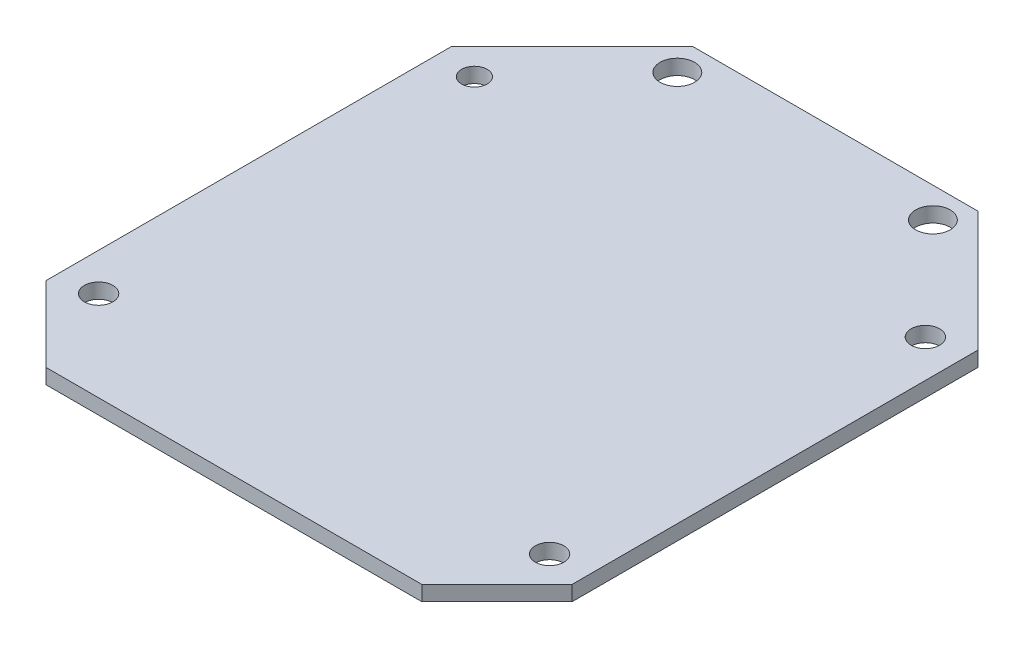
ISO-10303-21;
HEADER;
FILE_DESCRIPTION(('STEP AP214'),'2;1');
FILE_NAME('part.step','',(''),(''),'','','');
FILE_SCHEMA(('AUTOMOTIVE_DESIGN { 1 0 10303 214 1 1 1 1 }'));
ENDSEC;
DATA;
#1=APPLICATION_CONTEXT('core data for automotive mechanical design processes');
#2=APPLICATION_PROTOCOL_DEFINITION('international standard','automotive_design',2000,#1);
#3=PRODUCT_CONTEXT('',#1,'mechanical');
#4=PRODUCT('Part','Part','',(#3));
#5=PRODUCT_RELATED_PRODUCT_CATEGORY('part','',(#4));
#6=PRODUCT_DEFINITION_FORMATION('','',#4);
#7=PRODUCT_DEFINITION_CONTEXT('part definition',#1,'design');
#8=PRODUCT_DEFINITION('design','',#6,#7);
#9=PRODUCT_DEFINITION_SHAPE('','',#8);
#10=(LENGTH_UNIT() NAMED_UNIT(*) SI_UNIT(.MILLI.,.METRE.));
#11=(NAMED_UNIT(*) PLANE_ANGLE_UNIT() SI_UNIT($,.RADIAN.));
#12=(NAMED_UNIT(*) SI_UNIT($,.STERADIAN.) SOLID_ANGLE_UNIT());
#13=UNCERTAINTY_MEASURE_WITH_UNIT(LENGTH_MEASURE(1.E-05),#10,'distance_accuracy_value','');
#14=(GEOMETRIC_REPRESENTATION_CONTEXT(3) GLOBAL_UNCERTAINTY_ASSIGNED_CONTEXT((#13)) GLOBAL_UNIT_ASSIGNED_CONTEXT((#10,
#11,#12)) REPRESENTATION_CONTEXT('',''));
#15=CARTESIAN_POINT('',(0.,0.,0.));
#16=DIRECTION('',(0.,0.,1.));
#17=DIRECTION('',(1.,0.,0.));
#18=AXIS2_PLACEMENT_3D('',#15,#16,#17);
#19=CARTESIAN_POINT('',(35.,1.,1.8900618421344));
#20=DIRECTION('',(-0.707106781186549,0.,-0.707106781186546));
#21=DIRECTION('',(-0.707106781186546,0.,0.707106781186549));
#22=AXIS2_PLACEMENT_3D('',#19,#20,#21);
#23=PLANE('',#22);
#24=DIRECTION('',(0.707106781186546,0.,-0.707106781186549));
#25=VECTOR('',#24,1.);
#26=CARTESIAN_POINT('',(35.,0.,1.8900618421344));
#27=LINE('',#26,#25);
#28=CARTESIAN_POINT('',(30.,0.,6.89006184213443));
#29=VERTEX_POINT('',#28);
#30=CARTESIAN_POINT('',(35.,0.,1.8900618421344));
#31=VERTEX_POINT('',#30);
#32=EDGE_CURVE('E132',#29,#31,#27,.T.);
#33=ORIENTED_EDGE('',*,*,#32,.T.);
#34=DIRECTION('',(0.,-1.,0.));
#35=VECTOR('',#34,1.);
#36=CARTESIAN_POINT('',(35.,1.,1.8900618421344));
#37=LINE('',#36,#35);
#38=CARTESIAN_POINT('',(35.,1.,1.8900618421344));
#39=VERTEX_POINT('',#38);
#40=EDGE_CURVE('E11',#39,#31,#37,.T.);
#41=ORIENTED_EDGE('',*,*,#40,.F.);
#42=DIRECTION('',(0.707106781186546,0.,-0.707106781186549));
#43=VECTOR('',#42,1.);
#44=CARTESIAN_POINT('',(35.,1.,1.8900618421344));
#45=LINE('',#44,#43);
#46=CARTESIAN_POINT('',(30.,1.,6.89006184213443));
#47=VERTEX_POINT('',#46);
#48=EDGE_CURVE('E147',#47,#39,#45,.T.);
#49=ORIENTED_EDGE('',*,*,#48,.F.);
#50=DIRECTION('',(0.,-1.,0.));
#51=VECTOR('',#50,1.);
#52=CARTESIAN_POINT('',(30.,1.,6.89006184213443));
#53=LINE('',#52,#51);
#54=EDGE_CURVE('E128',#47,#29,#53,.T.);
#55=ORIENTED_EDGE('',*,*,#54,.T.);
#56=EDGE_LOOP('',(#33,#41,#49,#55));
#57=FACE_BOUND('',#56,.T.);
#58=ADVANCED_FACE('F36',(#57),#23,.F.);
#59=CARTESIAN_POINT('',(35.,1.,-25.1099381578656));
#60=DIRECTION('',(-1.,0.,0.));
#61=DIRECTION('',(0.,0.,1.));
#62=AXIS2_PLACEMENT_3D('',#59,#60,#61);
#63=PLANE('',#62);
#64=DIRECTION('',(0.,0.,-1.));
#65=VECTOR('',#64,1.);
#66=CARTESIAN_POINT('',(35.,0.,-25.1099381578656));
#67=LINE('',#66,#65);
#68=CARTESIAN_POINT('',(35.,0.,-25.1099381578656));
#69=VERTEX_POINT('',#68);
#70=EDGE_CURVE('E135',#31,#69,#67,.T.);
#71=ORIENTED_EDGE('',*,*,#70,.T.);
#72=DIRECTION('',(0.,-1.,0.));
#73=VECTOR('',#72,1.);
#74=CARTESIAN_POINT('',(35.,1.,-25.1099381578656));
#75=LINE('',#74,#73);
#76=CARTESIAN_POINT('',(35.,1.,-25.1099381578656));
#77=VERTEX_POINT('',#76);
#78=EDGE_CURVE('E44',#77,#69,#75,.T.);
#79=ORIENTED_EDGE('',*,*,#78,.F.);
#80=DIRECTION('',(0.,0.,-1.));
#81=VECTOR('',#80,1.);
#82=CARTESIAN_POINT('',(35.,1.,-25.1099381578656));
#83=LINE('',#82,#81);
#84=EDGE_CURVE('E95',#39,#77,#83,.T.);
#85=ORIENTED_EDGE('',*,*,#84,.F.);
#86=ORIENTED_EDGE('',*,*,#40,.T.);
#87=EDGE_LOOP('',(#71,#79,#85,#86));
#88=FACE_BOUND('',#87,.T.);
#89=ADVANCED_FACE('F255',(#88),#63,.F.);
#90=CARTESIAN_POINT('',(27.,1.,-33.1099381578656));
#91=DIRECTION('',(-0.707106781186549,0.,0.707106781186546));
#92=DIRECTION('',(0.707106781186546,0.,0.707106781186549));
#93=AXIS2_PLACEMENT_3D('',#90,#91,#92);
#94=PLANE('',#93);
#95=DIRECTION('',(-0.707106781186546,0.,-0.707106781186549));
#96=VECTOR('',#95,1.);
#97=CARTESIAN_POINT('',(27.,0.,-33.1099381578656));
#98=LINE('',#97,#96);
#99=CARTESIAN_POINT('',(27.,0.,-33.1099381578656));
#100=VERTEX_POINT('',#99);
#101=EDGE_CURVE('E138',#69,#100,#98,.T.);
#102=ORIENTED_EDGE('',*,*,#101,.T.);
#103=DIRECTION('',(0.,-1.,0.));
#104=VECTOR('',#103,1.);
#105=CARTESIAN_POINT('',(27.,1.,-33.1099381578656));
#106=LINE('',#105,#104);
#107=CARTESIAN_POINT('',(27.,1.,-33.1099381578656));
#108=VERTEX_POINT('',#107);
#109=EDGE_CURVE('E154',#108,#100,#106,.T.);
#110=ORIENTED_EDGE('',*,*,#109,.F.);
#111=DIRECTION('',(-0.707106781186546,0.,-0.707106781186549));
#112=VECTOR('',#111,1.);
#113=CARTESIAN_POINT('',(27.,1.,-33.1099381578656));
#114=LINE('',#113,#112);
#115=EDGE_CURVE('E162',#77,#108,#114,.T.);
#116=ORIENTED_EDGE('',*,*,#115,.F.);
#117=ORIENTED_EDGE('',*,*,#78,.T.);
#118=EDGE_LOOP('',(#102,#110,#116,#117));
#119=FACE_BOUND('',#118,.T.);
#120=ADVANCED_FACE('F160',(#119),#94,.F.);
#121=CARTESIAN_POINT('',(8.00000000000003,1.,-33.1099381578656));
#122=DIRECTION('',(0.,0.,1.));
#123=DIRECTION('',(1.,0.,0.));
#124=AXIS2_PLACEMENT_3D('',#121,#122,#123);
#125=PLANE('',#124);
#126=DIRECTION('',(-1.,0.,0.));
#127=VECTOR('',#126,1.);
#128=CARTESIAN_POINT('',(8.00000000000003,0.,-33.1099381578656));
#129=LINE('',#128,#127);
#130=CARTESIAN_POINT('',(8.00000000000003,0.,-33.1099381578656));
#131=VERTEX_POINT('',#130);
#132=EDGE_CURVE('E140',#100,#131,#129,.T.);
#133=ORIENTED_EDGE('',*,*,#132,.T.);
#134=DIRECTION('',(0.,-1.,0.));
#135=VECTOR('',#134,1.);
#136=CARTESIAN_POINT('',(8.00000000000003,1.,-33.1099381578656));
#137=LINE('',#136,#135);
#138=CARTESIAN_POINT('',(8.00000000000003,1.,-33.1099381578656));
#139=VERTEX_POINT('',#138);
#140=EDGE_CURVE('E151',#139,#131,#137,.T.);
#141=ORIENTED_EDGE('',*,*,#140,.F.);
#142=DIRECTION('',(-1.,0.,0.));
#143=VECTOR('',#142,1.);
#144=CARTESIAN_POINT('',(8.00000000000003,1.,-33.1099381578656));
#145=LINE('',#144,#143);
#146=EDGE_CURVE('E174',#108,#139,#145,.T.);
#147=ORIENTED_EDGE('',*,*,#146,.F.);
#148=ORIENTED_EDGE('',*,*,#109,.T.);
#149=EDGE_LOOP('',(#133,#141,#147,#148));
#150=FACE_BOUND('',#149,.T.);
#151=ADVANCED_FACE('F170',(#150),#125,.F.);
#152=CARTESIAN_POINT('',(0.,1.,-25.1099381578656));
#153=DIRECTION('',(0.707106781186546,0.,0.707106781186549));
#154=DIRECTION('',(0.707106781186549,0.,-0.707106781186546));
#155=AXIS2_PLACEMENT_3D('',#152,#153,#154);
#156=PLANE('',#155);
#157=DIRECTION('',(-0.707106781186549,0.,0.707106781186546));
#158=VECTOR('',#157,1.);
#159=CARTESIAN_POINT('',(0.,0.,-25.1099381578656));
#160=LINE('',#159,#158);
#161=CARTESIAN_POINT('',(0.,0.,-25.1099381578656));
#162=VERTEX_POINT('',#161);
#163=EDGE_CURVE('E142',#131,#162,#160,.T.);
#164=ORIENTED_EDGE('',*,*,#163,.T.);
#165=DIRECTION('',(0.,-1.,0.));
#166=VECTOR('',#165,1.);
#167=CARTESIAN_POINT('',(0.,1.,-25.1099381578656));
#168=LINE('',#167,#166);
#169=CARTESIAN_POINT('',(0.,1.,-25.1099381578656));
#170=VERTEX_POINT('',#169);
#171=EDGE_CURVE('E123',#170,#162,#168,.T.);
#172=ORIENTED_EDGE('',*,*,#171,.F.);
#173=DIRECTION('',(-0.707106781186549,0.,0.707106781186546));
#174=VECTOR('',#173,1.);
#175=CARTESIAN_POINT('',(0.,1.,-25.1099381578656));
#176=LINE('',#175,#174);
#177=EDGE_CURVE('E114',#139,#170,#176,.T.);
#178=ORIENTED_EDGE('',*,*,#177,.F.);
#179=ORIENTED_EDGE('',*,*,#140,.T.);
#180=EDGE_LOOP('',(#164,#172,#178,#179));
#181=FACE_BOUND('',#180,.T.);
#182=ADVANCED_FACE('F173',(#181),#156,.F.);
#183=CARTESIAN_POINT('',(0.,1.,1.89006184213442));
#184=DIRECTION('',(1.,0.,0.));
#185=DIRECTION('',(0.,0.,-1.));
#186=AXIS2_PLACEMENT_3D('',#183,#184,#185);
#187=PLANE('',#186);
#188=DIRECTION('',(0.,0.,1.));
#189=VECTOR('',#188,1.);
#190=CARTESIAN_POINT('',(0.,0.,1.89006184213442));
#191=LINE('',#190,#189);
#192=CARTESIAN_POINT('',(0.,0.,1.89006184213442));
#193=VERTEX_POINT('',#192);
#194=EDGE_CURVE('E122',#162,#193,#191,.T.);
#195=ORIENTED_EDGE('',*,*,#194,.T.);
#196=DIRECTION('',(0.,-1.,0.));
#197=VECTOR('',#196,1.);
#198=CARTESIAN_POINT('',(0.,1.,1.89006184213442));
#199=LINE('',#198,#197);
#200=CARTESIAN_POINT('',(0.,1.,1.89006184213442));
#201=VERTEX_POINT('',#200);
#202=EDGE_CURVE('E119',#201,#193,#199,.T.);
#203=ORIENTED_EDGE('',*,*,#202,.F.);
#204=DIRECTION('',(0.,0.,1.));
#205=VECTOR('',#204,1.);
#206=CARTESIAN_POINT('',(0.,1.,1.89006184213442));
#207=LINE('',#206,#205);
#208=EDGE_CURVE('E108',#170,#201,#207,.T.);
#209=ORIENTED_EDGE('',*,*,#208,.F.);
#210=ORIENTED_EDGE('',*,*,#171,.T.);
#211=EDGE_LOOP('',(#195,#203,#209,#210));
#212=FACE_BOUND('',#211,.T.);
#213=ADVANCED_FACE('F120',(#212),#187,.F.);
#214=CARTESIAN_POINT('',(5.,1.,6.89006184213443));
#215=DIRECTION('',(0.707106781186549,0.,-0.707106781186547));
#216=DIRECTION('',(-0.707106781186546,0.,-0.707106781186549));
#217=AXIS2_PLACEMENT_3D('',#214,#215,#216);
#218=PLANE('',#217);
#219=DIRECTION('',(0.707106781186546,0.,0.707106781186548));
#220=VECTOR('',#219,1.);
#221=CARTESIAN_POINT('',(5.,0.,6.89006184213443));
#222=LINE('',#221,#220);
#223=CARTESIAN_POINT('',(5.,0.,6.89006184213443));
#224=VERTEX_POINT('',#223);
#225=EDGE_CURVE('E81',#193,#224,#222,.T.);
#226=ORIENTED_EDGE('',*,*,#225,.T.);
#227=DIRECTION('',(0.,-1.,0.));
#228=VECTOR('',#227,1.);
#229=CARTESIAN_POINT('',(5.,1.,6.89006184213443));
#230=LINE('',#229,#228);
#231=CARTESIAN_POINT('',(5.,1.,6.89006184213443));
#232=VERTEX_POINT('',#231);
#233=EDGE_CURVE('E124',#232,#224,#230,.T.);
#234=ORIENTED_EDGE('',*,*,#233,.F.);
#235=DIRECTION('',(0.707106781186546,0.,0.707106781186548));
#236=VECTOR('',#235,1.);
#237=CARTESIAN_POINT('',(5.,1.,6.89006184213443));
#238=LINE('',#237,#236);
#239=EDGE_CURVE('E112',#201,#232,#238,.T.);
#240=ORIENTED_EDGE('',*,*,#239,.F.);
#241=ORIENTED_EDGE('',*,*,#202,.T.);
#242=EDGE_LOOP('',(#226,#234,#240,#241));
#243=FACE_BOUND('',#242,.T.);
#244=ADVANCED_FACE('F126',(#243),#218,.F.);
#245=CARTESIAN_POINT('',(30.,1.,6.89006184213443));
#246=DIRECTION('',(0.,0.,-1.));
#247=DIRECTION('',(-1.,0.,0.));
#248=AXIS2_PLACEMENT_3D('',#245,#246,#247);
#249=PLANE('',#248);
#250=DIRECTION('',(1.,0.,0.));
#251=VECTOR('',#250,1.);
#252=CARTESIAN_POINT('',(30.,0.,6.89006184213443));
#253=LINE('',#252,#251);
#254=EDGE_CURVE('E87',#224,#29,#253,.T.);
#255=ORIENTED_EDGE('',*,*,#254,.T.);
#256=ORIENTED_EDGE('',*,*,#54,.F.);
#257=DIRECTION('',(1.,0.,0.));
#258=VECTOR('',#257,1.);
#259=CARTESIAN_POINT('',(30.,1.,6.89006184213443));
#260=LINE('',#259,#258);
#261=EDGE_CURVE('E52',#232,#47,#260,.T.);
#262=ORIENTED_EDGE('',*,*,#261,.F.);
#263=ORIENTED_EDGE('',*,*,#233,.T.);
#264=EDGE_LOOP('',(#255,#256,#262,#263));
#265=FACE_BOUND('',#264,.T.);
#266=ADVANCED_FACE('F227',(#265),#249,.F.);
#267=CARTESIAN_POINT('',(0.,1.,0.));
#268=DIRECTION('',(0.,-1.,0.));
#269=DIRECTION('',(0.,0.,-1.));
#270=AXIS2_PLACEMENT_3D('',#267,#268,#269);
#271=PLANE('',#270);
#272=CARTESIAN_POINT('',(26.,1.,-31.1099381578656));
#273=DIRECTION('',(0.,1.,0.));
#274=DIRECTION('',(0.,0.,1.));
#275=AXIS2_PLACEMENT_3D('',#272,#273,#274);
#276=CIRCLE('',#275,1.15);
#277=CARTESIAN_POINT('',(26.,1.,-29.9599381578656));
#278=VERTEX_POINT('',#277);
#279=EDGE_CURVE('E210',#278,#278,#276,.T.);
#280=ORIENTED_EDGE('',*,*,#279,.F.);
#281=EDGE_LOOP('',(#280));
#282=FACE_BOUND('',#281,.T.);
#283=CARTESIAN_POINT('',(9.,1.,-31.1099381578656));
#284=DIRECTION('',(0.,1.,0.));
#285=DIRECTION('',(0.,0.,1.));
#286=AXIS2_PLACEMENT_3D('',#283,#284,#285);
#287=CIRCLE('',#286,1.15);
#288=CARTESIAN_POINT('',(9.,1.,-29.9599381578656));
#289=VERTEX_POINT('',#288);
#290=EDGE_CURVE('E204',#289,#289,#287,.T.);
#291=ORIENTED_EDGE('',*,*,#290,.F.);
#292=EDGE_LOOP('',(#291));
#293=FACE_BOUND('',#292,.T.);
#294=CARTESIAN_POINT('',(2.5,1.,0.890061842134429));
#295=DIRECTION('',(0.,1.,0.));
#296=DIRECTION('',(0.,0.,1.));
#297=AXIS2_PLACEMENT_3D('',#294,#295,#296);
#298=CIRCLE('',#297,0.95);
#299=CARTESIAN_POINT('',(2.5,1.,1.84006184213443));
#300=VERTEX_POINT('',#299);
#301=EDGE_CURVE('E193',#300,#300,#298,.T.);
#302=ORIENTED_EDGE('',*,*,#301,.F.);
#303=EDGE_LOOP('',(#302));
#304=FACE_BOUND('',#303,.T.);
#305=CARTESIAN_POINT('',(32.5,1.,-24.1099381578656));
#306=DIRECTION('',(0.,1.,0.));
#307=DIRECTION('',(0.,0.,1.));
#308=AXIS2_PLACEMENT_3D('',#305,#306,#307);
#309=CIRCLE('',#308,0.950000000000001);
#310=CARTESIAN_POINT('',(32.5,1.,-23.1599381578656));
#311=VERTEX_POINT('',#310);
#312=EDGE_CURVE('E186',#311,#311,#309,.T.);
#313=ORIENTED_EDGE('',*,*,#312,.F.);
#314=EDGE_LOOP('',(#313));
#315=FACE_BOUND('',#314,.T.);
#316=CARTESIAN_POINT('',(2.5,1.,-24.1099381578656));
#317=DIRECTION('',(0.,1.,0.));
#318=DIRECTION('',(0.,0.,1.));
#319=AXIS2_PLACEMENT_3D('',#316,#317,#318);
#320=CIRCLE('',#319,0.85);
#321=CARTESIAN_POINT('',(2.5,1.,-23.2599381578656));
#322=VERTEX_POINT('',#321);
#323=EDGE_CURVE('E198',#322,#322,#320,.T.);
#324=ORIENTED_EDGE('',*,*,#323,.F.);
#325=EDGE_LOOP('',(#324));
#326=FACE_BOUND('',#325,.T.);
#327=CARTESIAN_POINT('',(32.5,1.,0.89006184213443));
#328=DIRECTION('',(0.,1.,0.));
#329=DIRECTION('',(0.,0.,1.));
#330=AXIS2_PLACEMENT_3D('',#327,#328,#329);
#331=CIRCLE('',#330,0.950000000000001);
#332=CARTESIAN_POINT('',(32.5,1.,1.84006184213443));
#333=VERTEX_POINT('',#332);
#334=EDGE_CURVE('E180',#333,#333,#331,.T.);
#335=ORIENTED_EDGE('',*,*,#334,.F.);
#336=EDGE_LOOP('',(#335));
#337=FACE_BOUND('',#336,.T.);
#338=ORIENTED_EDGE('',*,*,#48,.T.);
#339=ORIENTED_EDGE('',*,*,#84,.T.);
#340=ORIENTED_EDGE('',*,*,#115,.T.);
#341=ORIENTED_EDGE('',*,*,#146,.T.);
#342=ORIENTED_EDGE('',*,*,#177,.T.);
#343=ORIENTED_EDGE('',*,*,#208,.T.);
#344=ORIENTED_EDGE('',*,*,#239,.T.);
#345=ORIENTED_EDGE('',*,*,#261,.T.);
#346=EDGE_LOOP('',(#338,#339,#340,#341,#342,#343,#344,#345));
#347=FACE_BOUND('',#346,.T.);
#348=ADVANCED_FACE('F110',(#282,#293,#304,#315,#326,#337,#347),#271,.F.);
#349=CARTESIAN_POINT('',(0.,0.,0.));
#350=DIRECTION('',(0.,-1.,0.));
#351=DIRECTION('',(0.,0.,-1.));
#352=AXIS2_PLACEMENT_3D('',#349,#350,#351);
#353=PLANE('',#352);
#354=CARTESIAN_POINT('',(26.,0.,-31.1099381578656));
#355=DIRECTION('',(0.,1.,0.));
#356=DIRECTION('',(0.,0.,1.));
#357=AXIS2_PLACEMENT_3D('',#354,#355,#356);
#358=CIRCLE('',#357,1.15);
#359=CARTESIAN_POINT('',(26.,0.,-29.9599381578656));
#360=VERTEX_POINT('',#359);
#361=EDGE_CURVE('E201',#360,#360,#358,.T.);
#362=ORIENTED_EDGE('',*,*,#361,.T.);
#363=EDGE_LOOP('',(#362));
#364=FACE_BOUND('',#363,.T.);
#365=CARTESIAN_POINT('',(9.,0.,-31.1099381578656));
#366=DIRECTION('',(0.,1.,0.));
#367=DIRECTION('',(0.,0.,1.));
#368=AXIS2_PLACEMENT_3D('',#365,#366,#367);
#369=CIRCLE('',#368,1.15);
#370=CARTESIAN_POINT('',(9.,0.,-29.9599381578656));
#371=VERTEX_POINT('',#370);
#372=EDGE_CURVE('E207',#371,#371,#369,.T.);
#373=ORIENTED_EDGE('',*,*,#372,.T.);
#374=EDGE_LOOP('',(#373));
#375=FACE_BOUND('',#374,.T.);
#376=CARTESIAN_POINT('',(2.5,0.,0.890061842134429));
#377=DIRECTION('',(0.,1.,0.));
#378=DIRECTION('',(0.,0.,1.));
#379=AXIS2_PLACEMENT_3D('',#376,#377,#378);
#380=CIRCLE('',#379,0.95);
#381=CARTESIAN_POINT('',(2.5,0.,1.84006184213443));
#382=VERTEX_POINT('',#381);
#383=EDGE_CURVE('E183',#382,#382,#380,.T.);
#384=ORIENTED_EDGE('',*,*,#383,.T.);
#385=EDGE_LOOP('',(#384));
#386=FACE_BOUND('',#385,.T.);
#387=CARTESIAN_POINT('',(32.5,0.,-24.1099381578656));
#388=DIRECTION('',(0.,1.,0.));
#389=DIRECTION('',(0.,0.,1.));
#390=AXIS2_PLACEMENT_3D('',#387,#388,#389);
#391=CIRCLE('',#390,0.950000000000001);
#392=CARTESIAN_POINT('',(32.5,0.,-23.1599381578656));
#393=VERTEX_POINT('',#392);
#394=EDGE_CURVE('E189',#393,#393,#391,.T.);
#395=ORIENTED_EDGE('',*,*,#394,.T.);
#396=EDGE_LOOP('',(#395));
#397=FACE_BOUND('',#396,.T.);
#398=CARTESIAN_POINT('',(2.5,0.,-24.1099381578656));
#399=DIRECTION('',(0.,1.,0.));
#400=DIRECTION('',(0.,0.,1.));
#401=AXIS2_PLACEMENT_3D('',#398,#399,#400);
#402=CIRCLE('',#401,0.85);
#403=CARTESIAN_POINT('',(2.5,0.,-23.2599381578656));
#404=VERTEX_POINT('',#403);
#405=EDGE_CURVE('E190',#404,#404,#402,.T.);
#406=ORIENTED_EDGE('',*,*,#405,.T.);
#407=EDGE_LOOP('',(#406));
#408=FACE_BOUND('',#407,.T.);
#409=CARTESIAN_POINT('',(32.5,0.,0.89006184213443));
#410=DIRECTION('',(0.,1.,0.));
#411=DIRECTION('',(0.,0.,1.));
#412=AXIS2_PLACEMENT_3D('',#409,#410,#411);
#413=CIRCLE('',#412,0.950000000000001);
#414=CARTESIAN_POINT('',(32.5,0.,1.84006184213443));
#415=VERTEX_POINT('',#414);
#416=EDGE_CURVE('E136',#415,#415,#413,.T.);
#417=ORIENTED_EDGE('',*,*,#416,.T.);
#418=EDGE_LOOP('',(#417));
#419=FACE_BOUND('',#418,.T.);
#420=ORIENTED_EDGE('',*,*,#32,.F.);
#421=ORIENTED_EDGE('',*,*,#254,.F.);
#422=ORIENTED_EDGE('',*,*,#225,.F.);
#423=ORIENTED_EDGE('',*,*,#194,.F.);
#424=ORIENTED_EDGE('',*,*,#163,.F.);
#425=ORIENTED_EDGE('',*,*,#132,.F.);
#426=ORIENTED_EDGE('',*,*,#101,.F.);
#427=ORIENTED_EDGE('',*,*,#70,.F.);
#428=EDGE_LOOP('',(#420,#421,#422,#423,#424,#425,#426,#427));
#429=FACE_BOUND('',#428,.T.);
#430=ADVANCED_FACE('F166',(#364,#375,#386,#397,#408,#419,#429),#353,.T.);
#431=CARTESIAN_POINT('',(32.5,0.,0.89006184213443));
#432=DIRECTION('',(0.,1.,0.));
#433=DIRECTION('',(0.,0.,1.));
#434=AXIS2_PLACEMENT_3D('',#431,#432,#433);
#435=CYLINDRICAL_SURFACE('',#434,0.950000000000001);
#436=ORIENTED_EDGE('',*,*,#416,.F.);
#437=EDGE_LOOP('',(#436));
#438=FACE_BOUND('',#437,.T.);
#439=ORIENTED_EDGE('',*,*,#334,.T.);
#440=EDGE_LOOP('',(#439));
#441=FACE_BOUND('',#440,.T.);
#442=ADVANCED_FACE('F239',(#438,#441),#435,.F.);
#443=CARTESIAN_POINT('',(2.5,0.,-24.1099381578656));
#444=DIRECTION('',(0.,1.,0.));
#445=DIRECTION('',(0.,0.,1.));
#446=AXIS2_PLACEMENT_3D('',#443,#444,#445);
#447=CYLINDRICAL_SURFACE('',#446,0.85);
#448=ORIENTED_EDGE('',*,*,#405,.F.);
#449=EDGE_LOOP('',(#448));
#450=FACE_BOUND('',#449,.T.);
#451=ORIENTED_EDGE('',*,*,#323,.T.);
#452=EDGE_LOOP('',(#451));
#453=FACE_BOUND('',#452,.T.);
#454=ADVANCED_FACE('F241',(#450,#453),#447,.F.);
#455=CARTESIAN_POINT('',(32.5,0.,-24.1099381578656));
#456=DIRECTION('',(0.,1.,0.));
#457=DIRECTION('',(0.,0.,1.));
#458=AXIS2_PLACEMENT_3D('',#455,#456,#457);
#459=CYLINDRICAL_SURFACE('',#458,0.950000000000001);
#460=ORIENTED_EDGE('',*,*,#394,.F.);
#461=EDGE_LOOP('',(#460));
#462=FACE_BOUND('',#461,.T.);
#463=ORIENTED_EDGE('',*,*,#312,.T.);
#464=EDGE_LOOP('',(#463));
#465=FACE_BOUND('',#464,.T.);
#466=ADVANCED_FACE('F248',(#462,#465),#459,.F.);
#467=CARTESIAN_POINT('',(2.5,0.,0.890061842134429));
#468=DIRECTION('',(0.,1.,0.));
#469=DIRECTION('',(0.,0.,1.));
#470=AXIS2_PLACEMENT_3D('',#467,#468,#469);
#471=CYLINDRICAL_SURFACE('',#470,0.95);
#472=ORIENTED_EDGE('',*,*,#383,.F.);
#473=EDGE_LOOP('',(#472));
#474=FACE_BOUND('',#473,.T.);
#475=ORIENTED_EDGE('',*,*,#301,.T.);
#476=EDGE_LOOP('',(#475));
#477=FACE_BOUND('',#476,.T.);
#478=ADVANCED_FACE('F321',(#474,#477),#471,.F.);
#479=CARTESIAN_POINT('',(9.,0.,-31.1099381578656));
#480=DIRECTION('',(0.,1.,0.));
#481=DIRECTION('',(0.,0.,1.));
#482=AXIS2_PLACEMENT_3D('',#479,#480,#481);
#483=CYLINDRICAL_SURFACE('',#482,1.15);
#484=ORIENTED_EDGE('',*,*,#372,.F.);
#485=EDGE_LOOP('',(#484));
#486=FACE_BOUND('',#485,.T.);
#487=ORIENTED_EDGE('',*,*,#290,.T.);
#488=EDGE_LOOP('',(#487));
#489=FACE_BOUND('',#488,.T.);
#490=ADVANCED_FACE('F221',(#486,#489),#483,.F.);
#491=CARTESIAN_POINT('',(26.,0.,-31.1099381578656));
#492=DIRECTION('',(0.,1.,0.));
#493=DIRECTION('',(0.,0.,1.));
#494=AXIS2_PLACEMENT_3D('',#491,#492,#493);
#495=CYLINDRICAL_SURFACE('',#494,1.15);
#496=ORIENTED_EDGE('',*,*,#361,.F.);
#497=EDGE_LOOP('',(#496));
#498=FACE_BOUND('',#497,.T.);
#499=ORIENTED_EDGE('',*,*,#279,.T.);
#500=EDGE_LOOP('',(#499));
#501=FACE_BOUND('',#500,.T.);
#502=ADVANCED_FACE('F218',(#498,#501),#495,.F.);
#503=CLOSED_SHELL('',(#58,#89,#120,#151,#182,#213,#244,#266,#348,#430,#442,#454,#466,#478,#490,#502));
#504=MANIFOLD_SOLID_BREP('B2',#503);
#505=ADVANCED_BREP_SHAPE_REPRESENTATION('',(#18,#504),#14);
#506=SHAPE_DEFINITION_REPRESENTATION(#9,#505);
ENDSEC;
END-ISO-10303-21;
